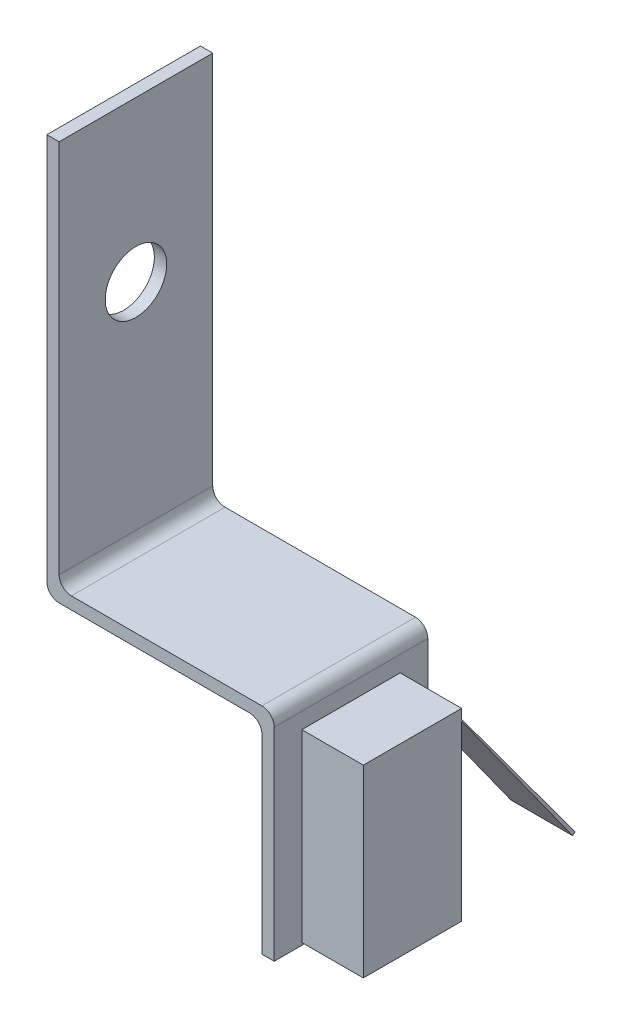
ISO-10303-21;
HEADER;
FILE_DESCRIPTION(('STEP AP214'),'2;1');
FILE_NAME('part.step','',(''),(''),'','','');
FILE_SCHEMA(('AUTOMOTIVE_DESIGN { 1 0 10303 214 1 1 1 1 }'));
ENDSEC;
DATA;
#1=APPLICATION_CONTEXT('core data for automotive mechanical design processes');
#2=APPLICATION_PROTOCOL_DEFINITION('international standard','automotive_design',2000,#1);
#3=PRODUCT_CONTEXT('',#1,'mechanical');
#4=PRODUCT('Part','Part','',(#3));
#5=PRODUCT_RELATED_PRODUCT_CATEGORY('part','',(#4));
#6=PRODUCT_DEFINITION_FORMATION('','',#4);
#7=PRODUCT_DEFINITION_CONTEXT('part definition',#1,'design');
#8=PRODUCT_DEFINITION('design','',#6,#7);
#9=PRODUCT_DEFINITION_SHAPE('','',#8);
#10=(LENGTH_UNIT() NAMED_UNIT(*) SI_UNIT(.MILLI.,.METRE.));
#11=(NAMED_UNIT(*) PLANE_ANGLE_UNIT() SI_UNIT($,.RADIAN.));
#12=(NAMED_UNIT(*) SI_UNIT($,.STERADIAN.) SOLID_ANGLE_UNIT());
#13=UNCERTAINTY_MEASURE_WITH_UNIT(LENGTH_MEASURE(1.E-05),#10,'distance_accuracy_value','');
#14=(GEOMETRIC_REPRESENTATION_CONTEXT(3) GLOBAL_UNCERTAINTY_ASSIGNED_CONTEXT((#13)) GLOBAL_UNIT_ASSIGNED_CONTEXT((#10,
#11,#12)) REPRESENTATION_CONTEXT('',''));
#15=CARTESIAN_POINT('',(0.,0.,0.));
#16=DIRECTION('',(0.,0.,1.));
#17=DIRECTION('',(1.,0.,0.));
#18=AXIS2_PLACEMENT_3D('',#15,#16,#17);
#19=CARTESIAN_POINT('',(47.,-67.6043528799355,-8.));
#20=DIRECTION('',(0.,0.,-1.));
#21=DIRECTION('',(0.,1.,0.));
#22=AXIS2_PLACEMENT_3D('',#19,#20,#21);
#23=PLANE('',#22);
#24=DIRECTION('',(1.,0.,0.));
#25=VECTOR('',#24,1.);
#26=CARTESIAN_POINT('',(37.,-69.4103994427794,-8.));
#27=LINE('',#26,#25);
#28=CARTESIAN_POINT('',(37.,-69.4103994427794,-8.));
#29=VERTEX_POINT('',#28);
#30=CARTESIAN_POINT('',(47.,-69.4103994427794,-8.));
#31=VERTEX_POINT('',#30);
#32=EDGE_CURVE('E210',#29,#31,#27,.T.);
#33=ORIENTED_EDGE('',*,*,#32,.T.);
#34=DIRECTION('',(0.,-1.,0.));
#35=VECTOR('',#34,1.);
#36=CARTESIAN_POINT('',(47.,-67.6043528799355,-8.));
#37=LINE('',#36,#35);
#38=CARTESIAN_POINT('',(47.,-97.6043528799355,-8.));
#39=VERTEX_POINT('',#38);
#40=EDGE_CURVE('E226',#31,#39,#37,.T.);
#41=ORIENTED_EDGE('',*,*,#40,.T.);
#42=DIRECTION('',(-1.,0.,0.));
#43=VECTOR('',#42,1.);
#44=CARTESIAN_POINT('',(47.,-97.6043528799355,-8.));
#45=LINE('',#44,#43);
#46=CARTESIAN_POINT('',(37.,-97.6043528799355,-8.));
#47=VERTEX_POINT('',#46);
#48=EDGE_CURVE('E247',#39,#47,#45,.T.);
#49=ORIENTED_EDGE('',*,*,#48,.T.);
#50=DIRECTION('',(0.,-1.,0.));
#51=VECTOR('',#50,1.);
#52=CARTESIAN_POINT('',(37.,-67.6043528799355,-8.));
#53=LINE('',#52,#51);
#54=EDGE_CURVE('E238',#29,#47,#53,.T.);
#55=ORIENTED_EDGE('',*,*,#54,.F.);
#56=EDGE_LOOP('',(#33,#41,#49,#55));
#57=FACE_BOUND('',#56,.T.);
#58=ADVANCED_FACE('F33',(#57),#23,.T.);
#59=CARTESIAN_POINT('',(37.,-63.,-12.5));
#60=DIRECTION('',(1.,0.,0.));
#61=DIRECTION('',(0.,0.,-1.));
#62=AXIS2_PLACEMENT_3D('',#59,#60,#61);
#63=PLANE('',#62);
#64=DIRECTION('',(0.,-0.812461065203267,-0.583015452221271));
#65=VECTOR('',#64,1.);
#66=CARTESIAN_POINT('',(37.,-94.559298490791,-26.0466454077713));
#67=LINE('',#66,#65);
#68=CARTESIAN_POINT('',(37.,-75.6813735301474,-12.5));
#69=VERTEX_POINT('',#68);
#70=EDGE_CURVE('E184',#29,#69,#67,.T.);
#71=ORIENTED_EDGE('',*,*,#70,.F.);
#72=ORIENTED_EDGE('',*,*,#54,.T.);
#73=DIRECTION('',(0.,0.,-1.));
#74=VECTOR('',#73,1.);
#75=CARTESIAN_POINT('',(37.,-97.6043528799355,8.));
#76=LINE('',#75,#74);
#77=CARTESIAN_POINT('',(37.,-97.6043528799355,8.));
#78=VERTEX_POINT('',#77);
#79=EDGE_CURVE('E235',#78,#47,#76,.T.);
#80=ORIENTED_EDGE('',*,*,#79,.F.);
#81=DIRECTION('',(0.,-1.,0.));
#82=VECTOR('',#81,1.);
#83=CARTESIAN_POINT('',(37.,-67.6043528799355,8.));
#84=LINE('',#83,#82);
#85=CARTESIAN_POINT('',(37.,-67.6043528799355,8.));
#86=VERTEX_POINT('',#85);
#87=EDGE_CURVE('E218',#86,#78,#84,.T.);
#88=ORIENTED_EDGE('',*,*,#87,.F.);
#89=DIRECTION('',(0.,0.,-1.));
#90=VECTOR('',#89,1.);
#91=CARTESIAN_POINT('',(37.,-67.6043528799355,8.));
#92=LINE('',#91,#90);
#93=CARTESIAN_POINT('',(37.,-67.6043528799355,-8.));
#94=VERTEX_POINT('',#93);
#95=EDGE_CURVE('E223',#86,#94,#92,.T.);
#96=ORIENTED_EDGE('',*,*,#95,.T.);
#97=CARTESIAN_POINT('',(37.,-69.1352525093614,-8.));
#98=VERTEX_POINT('',#97);
#99=EDGE_CURVE('E239',#94,#98,#53,.T.);
#100=ORIENTED_EDGE('',*,*,#99,.T.);
#101=DIRECTION('',(0.,0.805363368840596,0.592781447187516));
#102=VECTOR('',#101,1.);
#103=CARTESIAN_POINT('',(37.,-69.1352525093614,-8.));
#104=LINE('',#103,#102);
#105=CARTESIAN_POINT('',(37.,-75.2490321780362,-12.5));
#106=VERTEX_POINT('',#105);
#107=EDGE_CURVE('E48',#106,#98,#104,.T.);
#108=ORIENTED_EDGE('',*,*,#107,.F.);
#109=DIRECTION('',(0.,1.,0.));
#110=VECTOR('',#109,1.);
#111=CARTESIAN_POINT('',(37.,-63.,-12.5));
#112=LINE('',#111,#110);
#113=CARTESIAN_POINT('',(37.,-65.,-12.5));
#114=VERTEX_POINT('',#113);
#115=EDGE_CURVE('E292',#106,#114,#112,.T.);
#116=ORIENTED_EDGE('',*,*,#115,.T.);
#117=DIRECTION('',(0.,0.,1.));
#118=VECTOR('',#117,1.);
#119=CARTESIAN_POINT('',(37.,-65.,-12.5));
#120=LINE('',#119,#118);
#121=CARTESIAN_POINT('',(37.,-65.,12.5));
#122=VERTEX_POINT('',#121);
#123=EDGE_CURVE('E339',#114,#122,#120,.T.);
#124=ORIENTED_EDGE('',*,*,#123,.T.);
#125=DIRECTION('',(0.,1.,0.));
#126=VECTOR('',#125,1.);
#127=CARTESIAN_POINT('',(37.,-63.,12.5));
#128=LINE('',#127,#126);
#129=CARTESIAN_POINT('',(37.,-98.,12.5));
#130=VERTEX_POINT('',#129);
#131=EDGE_CURVE('E270',#130,#122,#128,.T.);
#132=ORIENTED_EDGE('',*,*,#131,.F.);
#133=DIRECTION('',(0.,0.,1.));
#134=VECTOR('',#133,1.);
#135=CARTESIAN_POINT('',(37.,-98.,-12.5));
#136=LINE('',#135,#134);
#137=CARTESIAN_POINT('',(37.,-98.,-12.5));
#138=VERTEX_POINT('',#137);
#139=EDGE_CURVE('E310',#138,#130,#136,.T.);
#140=ORIENTED_EDGE('',*,*,#139,.F.);
#141=EDGE_CURVE('E293',#138,#69,#112,.T.);
#142=ORIENTED_EDGE('',*,*,#141,.T.);
#143=EDGE_LOOP('',(#71,#72,#80,#88,#96,#100,#108,#116,#124,#132,#140,#142));
#144=FACE_BOUND('',#143,.T.);
#145=ADVANCED_FACE('F378',(#144),#63,.T.);
#146=CARTESIAN_POINT('',(0.,-65.,-12.5));
#147=DIRECTION('',(-1.,0.,0.));
#148=DIRECTION('',(0.,0.,1.));
#149=AXIS2_PLACEMENT_3D('',#146,#147,#148);
#150=PLANE('',#149);
#151=CARTESIAN_POINT('',(0.,-26.,0.));
#152=DIRECTION('',(1.,0.,0.));
#153=DIRECTION('',(0.,0.,-1.));
#154=AXIS2_PLACEMENT_3D('',#151,#152,#153);
#155=CIRCLE('',#154,5.);
#156=CARTESIAN_POINT('',(0.,-26.,-5.));
#157=VERTEX_POINT('',#156);
#158=EDGE_CURVE('E256',#157,#157,#155,.T.);
#159=ORIENTED_EDGE('',*,*,#158,.T.);
#160=EDGE_LOOP('',(#159));
#161=FACE_BOUND('',#160,.T.);
#162=DIRECTION('',(0.,-1.,0.));
#163=VECTOR('',#162,1.);
#164=CARTESIAN_POINT('',(0.,-65.,-12.5));
#165=LINE('',#164,#163);
#166=CARTESIAN_POINT('',(0.,0.,-12.5));
#167=VERTEX_POINT('',#166);
#168=CARTESIAN_POINT('',(0.,-63.,-12.5));
#169=VERTEX_POINT('',#168);
#170=EDGE_CURVE('E281',#167,#169,#165,.T.);
#171=ORIENTED_EDGE('',*,*,#170,.T.);
#172=DIRECTION('',(0.,0.,1.));
#173=VECTOR('',#172,1.);
#174=CARTESIAN_POINT('',(0.,-63.,-12.5));
#175=LINE('',#174,#173);
#176=CARTESIAN_POINT('',(0.,-63.,12.5));
#177=VERTEX_POINT('',#176);
#178=EDGE_CURVE('E320',#169,#177,#175,.T.);
#179=ORIENTED_EDGE('',*,*,#178,.T.);
#180=DIRECTION('',(0.,-1.,0.));
#181=VECTOR('',#180,1.);
#182=CARTESIAN_POINT('',(0.,-65.,12.5));
#183=LINE('',#182,#181);
#184=CARTESIAN_POINT('',(0.,0.,12.5));
#185=VERTEX_POINT('',#184);
#186=EDGE_CURVE('E259',#185,#177,#183,.T.);
#187=ORIENTED_EDGE('',*,*,#186,.F.);
#188=DIRECTION('',(0.,0.,1.));
#189=VECTOR('',#188,1.);
#190=CARTESIAN_POINT('',(0.,0.,-12.5));
#191=LINE('',#190,#189);
#192=EDGE_CURVE('E304',#167,#185,#191,.T.);
#193=ORIENTED_EDGE('',*,*,#192,.F.);
#194=EDGE_LOOP('',(#171,#179,#187,#193));
#195=FACE_BOUND('',#194,.T.);
#196=ADVANCED_FACE('F404',(#161,#195),#150,.T.);
#197=CARTESIAN_POINT('',(0.,0.,-12.5));
#198=DIRECTION('',(0.,1.,0.));
#199=DIRECTION('',(0.,0.,1.));
#200=AXIS2_PLACEMENT_3D('',#197,#198,#199);
#201=PLANE('',#200);
#202=ORIENTED_EDGE('',*,*,#192,.T.);
#203=DIRECTION('',(-1.,0.,0.));
#204=VECTOR('',#203,1.);
#205=CARTESIAN_POINT('',(0.,0.,12.5));
#206=LINE('',#205,#204);
#207=CARTESIAN_POINT('',(2.,0.,12.5));
#208=VERTEX_POINT('',#207);
#209=EDGE_CURVE('E278',#208,#185,#206,.T.);
#210=ORIENTED_EDGE('',*,*,#209,.F.);
#211=DIRECTION('',(0.,0.,1.));
#212=VECTOR('',#211,1.);
#213=CARTESIAN_POINT('',(2.,0.,-12.5));
#214=LINE('',#213,#212);
#215=CARTESIAN_POINT('',(2.,0.,-12.5));
#216=VERTEX_POINT('',#215);
#217=EDGE_CURVE('E307',#216,#208,#214,.T.);
#218=ORIENTED_EDGE('',*,*,#217,.F.);
#219=DIRECTION('',(-1.,0.,0.));
#220=VECTOR('',#219,1.);
#221=CARTESIAN_POINT('',(0.,0.,-12.5));
#222=LINE('',#221,#220);
#223=EDGE_CURVE('E300',#216,#167,#222,.T.);
#224=ORIENTED_EDGE('',*,*,#223,.T.);
#225=EDGE_LOOP('',(#202,#210,#218,#224));
#226=FACE_BOUND('',#225,.T.);
#227=ADVANCED_FACE('F407',(#226),#201,.T.);
#228=CARTESIAN_POINT('',(2.,0.,-12.5));
#229=DIRECTION('',(1.,0.,0.));
#230=DIRECTION('',(0.,1.,0.));
#231=AXIS2_PLACEMENT_3D('',#228,#229,#230);
#232=PLANE('',#231);
#233=CARTESIAN_POINT('',(2.,-26.,0.));
#234=DIRECTION('',(1.,0.,0.));
#235=DIRECTION('',(0.,0.,-1.));
#236=AXIS2_PLACEMENT_3D('',#233,#234,#235);
#237=CIRCLE('',#236,5.);
#238=CARTESIAN_POINT('',(2.,-26.,-5.));
#239=VERTEX_POINT('',#238);
#240=EDGE_CURVE('E253',#239,#239,#237,.T.);
#241=ORIENTED_EDGE('',*,*,#240,.F.);
#242=EDGE_LOOP('',(#241));
#243=FACE_BOUND('',#242,.T.);
#244=DIRECTION('',(0.,1.,0.));
#245=VECTOR('',#244,1.);
#246=CARTESIAN_POINT('',(2.,0.,12.5));
#247=LINE('',#246,#245);
#248=CARTESIAN_POINT('',(2.00000000000001,-61.,12.5));
#249=VERTEX_POINT('',#248);
#250=EDGE_CURVE('E276',#249,#208,#247,.T.);
#251=ORIENTED_EDGE('',*,*,#250,.F.);
#252=DIRECTION('',(0.,0.,1.));
#253=VECTOR('',#252,1.);
#254=CARTESIAN_POINT('',(2.00000000000001,-61.,-12.5));
#255=LINE('',#254,#253);
#256=CARTESIAN_POINT('',(2.00000000000001,-61.,-12.5));
#257=VERTEX_POINT('',#256);
#258=EDGE_CURVE('E337',#249,#257,#255,.F.);
#259=ORIENTED_EDGE('',*,*,#258,.T.);
#260=DIRECTION('',(0.,1.,0.));
#261=VECTOR('',#260,1.);
#262=CARTESIAN_POINT('',(2.,0.,-12.5));
#263=LINE('',#262,#261);
#264=EDGE_CURVE('E298',#257,#216,#263,.T.);
#265=ORIENTED_EDGE('',*,*,#264,.T.);
#266=ORIENTED_EDGE('',*,*,#217,.T.);
#267=EDGE_LOOP('',(#251,#259,#265,#266));
#268=FACE_BOUND('',#267,.T.);
#269=ADVANCED_FACE('F353',(#243,#268),#232,.T.);
#270=CARTESIAN_POINT('',(2.00000000000001,-63.,-12.5));
#271=DIRECTION('',(0.,1.,0.));
#272=DIRECTION('',(0.,0.,1.));
#273=AXIS2_PLACEMENT_3D('',#270,#271,#272);
#274=PLANE('',#273);
#275=DIRECTION('',(-1.,0.,0.));
#276=VECTOR('',#275,1.);
#277=CARTESIAN_POINT('',(2.00000000000001,-63.,-12.5));
#278=LINE('',#277,#276);
#279=CARTESIAN_POINT('',(35.,-63.,-12.5));
#280=VERTEX_POINT('',#279);
#281=CARTESIAN_POINT('',(4.00000000000001,-63.,-12.5));
#282=VERTEX_POINT('',#281);
#283=EDGE_CURVE('E295',#280,#282,#278,.T.);
#284=ORIENTED_EDGE('',*,*,#283,.T.);
#285=DIRECTION('',(0.,0.,1.));
#286=VECTOR('',#285,1.);
#287=CARTESIAN_POINT('',(4.00000000000001,-63.,12.5));
#288=LINE('',#287,#286);
#289=CARTESIAN_POINT('',(4.00000000000001,-63.,12.5));
#290=VERTEX_POINT('',#289);
#291=EDGE_CURVE('E334',#282,#290,#288,.T.);
#292=ORIENTED_EDGE('',*,*,#291,.T.);
#293=DIRECTION('',(-1.,0.,0.));
#294=VECTOR('',#293,1.);
#295=CARTESIAN_POINT('',(2.00000000000001,-63.,12.5));
#296=LINE('',#295,#294);
#297=CARTESIAN_POINT('',(35.,-63.,12.5));
#298=VERTEX_POINT('',#297);
#299=EDGE_CURVE('E273',#298,#290,#296,.T.);
#300=ORIENTED_EDGE('',*,*,#299,.F.);
#301=DIRECTION('',(0.,0.,1.));
#302=VECTOR('',#301,1.);
#303=CARTESIAN_POINT('',(35.,-63.,-12.5));
#304=LINE('',#303,#302);
#305=EDGE_CURVE('E332',#298,#280,#304,.F.);
#306=ORIENTED_EDGE('',*,*,#305,.T.);
#307=EDGE_LOOP('',(#284,#292,#300,#306));
#308=FACE_BOUND('',#307,.T.);
#309=ADVANCED_FACE('F365',(#308),#274,.T.);
#310=CARTESIAN_POINT('',(37.,-98.,-12.5));
#311=DIRECTION('',(0.,-1.,0.));
#312=DIRECTION('',(1.,0.,0.));
#313=AXIS2_PLACEMENT_3D('',#310,#311,#312);
#314=PLANE('',#313);
#315=ORIENTED_EDGE('',*,*,#139,.T.);
#316=DIRECTION('',(1.,0.,0.));
#317=VECTOR('',#316,1.);
#318=CARTESIAN_POINT('',(37.,-98.,12.5));
#319=LINE('',#318,#317);
#320=CARTESIAN_POINT('',(35.,-98.,12.5));
#321=VERTEX_POINT('',#320);
#322=EDGE_CURVE('E267',#321,#130,#319,.T.);
#323=ORIENTED_EDGE('',*,*,#322,.F.);
#324=DIRECTION('',(0.,0.,1.));
#325=VECTOR('',#324,1.);
#326=CARTESIAN_POINT('',(35.,-98.,-12.5));
#327=LINE('',#326,#325);
#328=CARTESIAN_POINT('',(35.,-98.,-12.5));
#329=VERTEX_POINT('',#328);
#330=EDGE_CURVE('E303',#329,#321,#327,.T.);
#331=ORIENTED_EDGE('',*,*,#330,.F.);
#332=DIRECTION('',(1.,0.,0.));
#333=VECTOR('',#332,1.);
#334=CARTESIAN_POINT('',(37.,-98.,-12.5));
#335=LINE('',#334,#333);
#336=EDGE_CURVE('E289',#329,#138,#335,.T.);
#337=ORIENTED_EDGE('',*,*,#336,.T.);
#338=EDGE_LOOP('',(#315,#323,#331,#337));
#339=FACE_BOUND('',#338,.T.);
#340=ADVANCED_FACE('F384',(#339),#314,.T.);
#341=CARTESIAN_POINT('',(35.,-98.,-12.5));
#342=DIRECTION('',(-1.,0.,0.));
#343=DIRECTION('',(0.,0.,1.));
#344=AXIS2_PLACEMENT_3D('',#341,#342,#343);
#345=PLANE('',#344);
#346=DIRECTION('',(0.,-1.,0.));
#347=VECTOR('',#346,1.);
#348=CARTESIAN_POINT('',(35.,-98.,12.5));
#349=LINE('',#348,#347);
#350=CARTESIAN_POINT('',(35.,-67.,12.5));
#351=VERTEX_POINT('',#350);
#352=EDGE_CURVE('E265',#351,#321,#349,.T.);
#353=ORIENTED_EDGE('',*,*,#352,.F.);
#354=DIRECTION('',(0.,0.,1.));
#355=VECTOR('',#354,1.);
#356=CARTESIAN_POINT('',(35.,-67.,-12.5));
#357=LINE('',#356,#355);
#358=CARTESIAN_POINT('',(35.,-67.,-12.5));
#359=VERTEX_POINT('',#358);
#360=EDGE_CURVE('E318',#351,#359,#357,.F.);
#361=ORIENTED_EDGE('',*,*,#360,.T.);
#362=DIRECTION('',(0.,-1.,0.));
#363=VECTOR('',#362,1.);
#364=CARTESIAN_POINT('',(35.,-98.,-12.5));
#365=LINE('',#364,#363);
#366=EDGE_CURVE('E287',#359,#329,#365,.T.);
#367=ORIENTED_EDGE('',*,*,#366,.T.);
#368=ORIENTED_EDGE('',*,*,#330,.T.);
#369=EDGE_LOOP('',(#353,#361,#367,#368));
#370=FACE_BOUND('',#369,.T.);
#371=ADVANCED_FACE('F388',(#370),#345,.T.);
#372=CARTESIAN_POINT('',(35.,-65.,-12.5));
#373=DIRECTION('',(0.,-1.,0.));
#374=DIRECTION('',(0.,0.,-1.));
#375=AXIS2_PLACEMENT_3D('',#372,#373,#374);
#376=PLANE('',#375);
#377=DIRECTION('',(1.,0.,0.));
#378=VECTOR('',#377,1.);
#379=CARTESIAN_POINT('',(35.,-65.,-12.5));
#380=LINE('',#379,#378);
#381=CARTESIAN_POINT('',(2.,-65.,-12.5));
#382=VERTEX_POINT('',#381);
#383=CARTESIAN_POINT('',(33.,-65.,-12.5));
#384=VERTEX_POINT('',#383);
#385=EDGE_CURVE('E284',#382,#384,#380,.T.);
#386=ORIENTED_EDGE('',*,*,#385,.T.);
#387=DIRECTION('',(0.,0.,1.));
#388=VECTOR('',#387,1.);
#389=CARTESIAN_POINT('',(33.,-65.,12.5));
#390=LINE('',#389,#388);
#391=CARTESIAN_POINT('',(33.,-65.,12.5));
#392=VERTEX_POINT('',#391);
#393=EDGE_CURVE('E315',#384,#392,#390,.T.);
#394=ORIENTED_EDGE('',*,*,#393,.T.);
#395=DIRECTION('',(1.,0.,0.));
#396=VECTOR('',#395,1.);
#397=CARTESIAN_POINT('',(35.,-65.,12.5));
#398=LINE('',#397,#396);
#399=CARTESIAN_POINT('',(2.,-65.,12.5));
#400=VERTEX_POINT('',#399);
#401=EDGE_CURVE('E262',#400,#392,#398,.T.);
#402=ORIENTED_EDGE('',*,*,#401,.F.);
#403=DIRECTION('',(0.,0.,1.));
#404=VECTOR('',#403,1.);
#405=CARTESIAN_POINT('',(2.,-65.,-12.5));
#406=LINE('',#405,#404);
#407=EDGE_CURVE('E306',#400,#382,#406,.F.);
#408=ORIENTED_EDGE('',*,*,#407,.T.);
#409=EDGE_LOOP('',(#386,#394,#402,#408));
#410=FACE_BOUND('',#409,.T.);
#411=ADVANCED_FACE('F396',(#410),#376,.T.);
#412=CARTESIAN_POINT('',(0.,0.,-12.5));
#413=DIRECTION('',(0.,0.,-1.));
#414=DIRECTION('',(-1.,0.,0.));
#415=AXIS2_PLACEMENT_3D('',#412,#413,#414);
#416=PLANE('',#415);
#417=ORIENTED_EDGE('',*,*,#385,.F.);
#418=CARTESIAN_POINT('',(2.,-63.,-12.5));
#419=DIRECTION('',(0.,0.,-1.));
#420=DIRECTION('',(-1.,0.,0.));
#421=AXIS2_PLACEMENT_3D('',#418,#419,#420);
#422=CIRCLE('',#421,2.);
#423=EDGE_CURVE('E330',#382,#169,#422,.T.);
#424=ORIENTED_EDGE('',*,*,#423,.T.);
#425=ORIENTED_EDGE('',*,*,#170,.F.);
#426=ORIENTED_EDGE('',*,*,#223,.F.);
#427=ORIENTED_EDGE('',*,*,#264,.F.);
#428=CARTESIAN_POINT('',(4.00000000000001,-61.,-12.5));
#429=DIRECTION('',(0.,0.,-1.));
#430=DIRECTION('',(-1.,0.,0.));
#431=AXIS2_PLACEMENT_3D('',#428,#429,#430);
#432=CIRCLE('',#431,2.);
#433=EDGE_CURVE('E11',#257,#282,#432,.F.);
#434=ORIENTED_EDGE('',*,*,#433,.T.);
#435=ORIENTED_EDGE('',*,*,#283,.F.);
#436=CARTESIAN_POINT('',(35.,-65.,-12.5));
#437=DIRECTION('',(0.,0.,-1.));
#438=DIRECTION('',(-1.,0.,0.));
#439=AXIS2_PLACEMENT_3D('',#436,#437,#438);
#440=CIRCLE('',#439,2.);
#441=EDGE_CURVE('E327',#280,#114,#440,.T.);
#442=ORIENTED_EDGE('',*,*,#441,.T.);
#443=ORIENTED_EDGE('',*,*,#115,.F.);
#444=DIRECTION('',(0.,-1.,0.));
#445=VECTOR('',#444,1.);
#446=CARTESIAN_POINT('',(37.,0.,-12.5));
#447=LINE('',#446,#445);
#448=EDGE_CURVE('E55',#106,#69,#447,.T.);
#449=ORIENTED_EDGE('',*,*,#448,.T.);
#450=ORIENTED_EDGE('',*,*,#141,.F.);
#451=ORIENTED_EDGE('',*,*,#336,.F.);
#452=ORIENTED_EDGE('',*,*,#366,.F.);
#453=CARTESIAN_POINT('',(33.,-67.,-12.5));
#454=DIRECTION('',(0.,0.,-1.));
#455=DIRECTION('',(-1.,0.,0.));
#456=AXIS2_PLACEMENT_3D('',#453,#454,#455);
#457=CIRCLE('',#456,2.);
#458=EDGE_CURVE('E344',#359,#384,#457,.F.);
#459=ORIENTED_EDGE('',*,*,#458,.T.);
#460=EDGE_LOOP('',(#417,#424,#425,#426,#427,#434,#435,#442,#443,#449,#450,#451,#452,#459));
#461=FACE_BOUND('',#460,.T.);
#462=ADVANCED_FACE('F361',(#461),#416,.T.);
#463=CARTESIAN_POINT('',(0.,0.,12.5));
#464=DIRECTION('',(0.,0.,-1.));
#465=DIRECTION('',(-1.,0.,0.));
#466=AXIS2_PLACEMENT_3D('',#463,#464,#465);
#467=PLANE('',#466);
#468=ORIENTED_EDGE('',*,*,#186,.T.);
#469=CARTESIAN_POINT('',(2.,-63.,12.5));
#470=DIRECTION('',(0.,0.,-1.));
#471=DIRECTION('',(-1.,0.,0.));
#472=AXIS2_PLACEMENT_3D('',#469,#470,#471);
#473=CIRCLE('',#472,2.);
#474=EDGE_CURVE('E325',#177,#400,#473,.F.);
#475=ORIENTED_EDGE('',*,*,#474,.T.);
#476=ORIENTED_EDGE('',*,*,#401,.T.);
#477=CARTESIAN_POINT('',(33.,-67.,12.5));
#478=DIRECTION('',(0.,0.,-1.));
#479=DIRECTION('',(-1.,0.,0.));
#480=AXIS2_PLACEMENT_3D('',#477,#478,#479);
#481=CIRCLE('',#480,2.);
#482=EDGE_CURVE('E342',#392,#351,#481,.T.);
#483=ORIENTED_EDGE('',*,*,#482,.T.);
#484=ORIENTED_EDGE('',*,*,#352,.T.);
#485=ORIENTED_EDGE('',*,*,#322,.T.);
#486=ORIENTED_EDGE('',*,*,#131,.T.);
#487=CARTESIAN_POINT('',(35.,-65.,12.5));
#488=DIRECTION('',(0.,0.,-1.));
#489=DIRECTION('',(-1.,0.,0.));
#490=AXIS2_PLACEMENT_3D('',#487,#488,#489);
#491=CIRCLE('',#490,2.);
#492=EDGE_CURVE('E323',#122,#298,#491,.F.);
#493=ORIENTED_EDGE('',*,*,#492,.T.);
#494=ORIENTED_EDGE('',*,*,#299,.T.);
#495=CARTESIAN_POINT('',(4.00000000000001,-61.,12.5));
#496=DIRECTION('',(0.,0.,-1.));
#497=DIRECTION('',(-1.,0.,0.));
#498=AXIS2_PLACEMENT_3D('',#495,#496,#497);
#499=CIRCLE('',#498,2.);
#500=EDGE_CURVE('E41',#290,#249,#499,.T.);
#501=ORIENTED_EDGE('',*,*,#500,.T.);
#502=ORIENTED_EDGE('',*,*,#250,.T.);
#503=ORIENTED_EDGE('',*,*,#209,.T.);
#504=EDGE_LOOP('',(#468,#475,#476,#483,#484,#485,#486,#493,#494,#501,#502,#503));
#505=FACE_BOUND('',#504,.T.);
#506=ADVANCED_FACE('F347',(#505),#467,.F.);
#507=CARTESIAN_POINT('',(2.,-26.,0.));
#508=DIRECTION('',(1.,0.,0.));
#509=DIRECTION('',(0.,0.,-1.));
#510=AXIS2_PLACEMENT_3D('',#507,#508,#509);
#511=CYLINDRICAL_SURFACE('',#510,5.);
#512=ORIENTED_EDGE('',*,*,#158,.F.);
#513=EDGE_LOOP('',(#512));
#514=FACE_BOUND('',#513,.T.);
#515=ORIENTED_EDGE('',*,*,#240,.T.);
#516=EDGE_LOOP('',(#515));
#517=FACE_BOUND('',#516,.T.);
#518=ADVANCED_FACE('F451',(#514,#517),#511,.F.);
#519=CARTESIAN_POINT('',(33.,-67.,-12.5));
#520=DIRECTION('',(0.,0.,-1.));
#521=DIRECTION('',(-1.,0.,0.));
#522=AXIS2_PLACEMENT_3D('',#519,#520,#521);
#523=CYLINDRICAL_SURFACE('',#522,2.);
#524=ORIENTED_EDGE('',*,*,#458,.F.);
#525=ORIENTED_EDGE('',*,*,#360,.F.);
#526=ORIENTED_EDGE('',*,*,#482,.F.);
#527=ORIENTED_EDGE('',*,*,#393,.F.);
#528=EDGE_LOOP('',(#524,#525,#526,#527));
#529=FACE_BOUND('',#528,.T.);
#530=ADVANCED_FACE('F393',(#529),#523,.F.);
#531=CARTESIAN_POINT('',(2.,-63.,-12.5));
#532=DIRECTION('',(0.,0.,1.));
#533=DIRECTION('',(1.,0.,0.));
#534=AXIS2_PLACEMENT_3D('',#531,#532,#533);
#535=CYLINDRICAL_SURFACE('',#534,2.);
#536=ORIENTED_EDGE('',*,*,#423,.F.);
#537=ORIENTED_EDGE('',*,*,#407,.F.);
#538=ORIENTED_EDGE('',*,*,#474,.F.);
#539=ORIENTED_EDGE('',*,*,#178,.F.);
#540=EDGE_LOOP('',(#536,#537,#538,#539));
#541=FACE_BOUND('',#540,.T.);
#542=ADVANCED_FACE('F402',(#541),#535,.T.);
#543=CARTESIAN_POINT('',(4.00000000000001,-61.,-12.5));
#544=DIRECTION('',(0.,0.,-1.));
#545=DIRECTION('',(-1.,0.,0.));
#546=AXIS2_PLACEMENT_3D('',#543,#544,#545);
#547=CYLINDRICAL_SURFACE('',#546,2.);
#548=ORIENTED_EDGE('',*,*,#433,.F.);
#549=ORIENTED_EDGE('',*,*,#258,.F.);
#550=ORIENTED_EDGE('',*,*,#500,.F.);
#551=ORIENTED_EDGE('',*,*,#291,.F.);
#552=EDGE_LOOP('',(#548,#549,#550,#551));
#553=FACE_BOUND('',#552,.T.);
#554=ADVANCED_FACE('F358',(#553),#547,.F.);
#555=CARTESIAN_POINT('',(35.,-65.,-12.5));
#556=DIRECTION('',(0.,0.,1.));
#557=DIRECTION('',(1.,0.,0.));
#558=AXIS2_PLACEMENT_3D('',#555,#556,#557);
#559=CYLINDRICAL_SURFACE('',#558,2.);
#560=ORIENTED_EDGE('',*,*,#441,.F.);
#561=ORIENTED_EDGE('',*,*,#305,.F.);
#562=ORIENTED_EDGE('',*,*,#492,.F.);
#563=ORIENTED_EDGE('',*,*,#123,.F.);
#564=EDGE_LOOP('',(#560,#561,#562,#563));
#565=FACE_BOUND('',#564,.T.);
#566=ADVANCED_FACE('F35',(#565),#559,.T.);
#567=CARTESIAN_POINT('',(47.,-67.6043528799355,8.));
#568=DIRECTION('',(0.,0.,-1.));
#569=DIRECTION('',(-1.,0.,0.));
#570=AXIS2_PLACEMENT_3D('',#567,#568,#569);
#571=PLANE('',#570);
#572=ORIENTED_EDGE('',*,*,#87,.T.);
#573=DIRECTION('',(-1.,0.,0.));
#574=VECTOR('',#573,1.);
#575=CARTESIAN_POINT('',(47.,-97.6043528799355,8.));
#576=LINE('',#575,#574);
#577=CARTESIAN_POINT('',(47.,-97.6043528799355,8.));
#578=VERTEX_POINT('',#577);
#579=EDGE_CURVE('E250',#578,#78,#576,.T.);
#580=ORIENTED_EDGE('',*,*,#579,.F.);
#581=DIRECTION('',(0.,-1.,0.));
#582=VECTOR('',#581,1.);
#583=CARTESIAN_POINT('',(47.,-67.6043528799355,8.));
#584=LINE('',#583,#582);
#585=CARTESIAN_POINT('',(47.,-67.6043528799355,8.));
#586=VERTEX_POINT('',#585);
#587=EDGE_CURVE('E219',#586,#578,#584,.T.);
#588=ORIENTED_EDGE('',*,*,#587,.F.);
#589=DIRECTION('',(-1.,0.,0.));
#590=VECTOR('',#589,1.);
#591=CARTESIAN_POINT('',(47.,-67.6043528799355,8.));
#592=LINE('',#591,#590);
#593=EDGE_CURVE('E232',#586,#86,#592,.T.);
#594=ORIENTED_EDGE('',*,*,#593,.T.);
#595=EDGE_LOOP('',(#572,#580,#588,#594));
#596=FACE_BOUND('',#595,.T.);
#597=ADVANCED_FACE('F437',(#596),#571,.F.);
#598=CARTESIAN_POINT('',(47.,-97.6043528799355,8.));
#599=DIRECTION('',(0.,1.,0.));
#600=DIRECTION('',(0.,0.,1.));
#601=AXIS2_PLACEMENT_3D('',#598,#599,#600);
#602=PLANE('',#601);
#603=ORIENTED_EDGE('',*,*,#79,.T.);
#604=ORIENTED_EDGE('',*,*,#48,.F.);
#605=DIRECTION('',(0.,0.,-1.));
#606=VECTOR('',#605,1.);
#607=CARTESIAN_POINT('',(47.,-97.6043528799355,8.));
#608=LINE('',#607,#606);
#609=EDGE_CURVE('E222',#578,#39,#608,.T.);
#610=ORIENTED_EDGE('',*,*,#609,.F.);
#611=ORIENTED_EDGE('',*,*,#579,.T.);
#612=EDGE_LOOP('',(#603,#604,#610,#611));
#613=FACE_BOUND('',#612,.T.);
#614=ADVANCED_FACE('F430',(#613),#602,.F.);
#615=DIRECTION('',(1.,0.,0.));
#616=VECTOR('',#615,1.);
#617=CARTESIAN_POINT('',(37.,-69.1352525093614,-8.));
#618=LINE('',#617,#616);
#619=CARTESIAN_POINT('',(47.,-69.1352525093614,-8.));
#620=VERTEX_POINT('',#619);
#621=EDGE_CURVE('E213',#98,#620,#618,.T.);
#622=ORIENTED_EDGE('',*,*,#621,.F.);
#623=ORIENTED_EDGE('',*,*,#99,.F.);
#624=DIRECTION('',(-1.,0.,0.));
#625=VECTOR('',#624,1.);
#626=CARTESIAN_POINT('',(47.,-67.6043528799355,-8.));
#627=LINE('',#626,#625);
#628=CARTESIAN_POINT('',(47.,-67.6043528799355,-8.));
#629=VERTEX_POINT('',#628);
#630=EDGE_CURVE('E244',#629,#94,#627,.T.);
#631=ORIENTED_EDGE('',*,*,#630,.F.);
#632=EDGE_CURVE('E227',#629,#620,#37,.T.);
#633=ORIENTED_EDGE('',*,*,#632,.T.);
#634=EDGE_LOOP('',(#622,#623,#631,#633));
#635=FACE_BOUND('',#634,.T.);
#636=ADVANCED_FACE('F421',(#635),#23,.T.);
#637=CARTESIAN_POINT('',(47.,-67.6043528799355,8.));
#638=DIRECTION('',(0.,1.,0.));
#639=DIRECTION('',(0.,0.,1.));
#640=AXIS2_PLACEMENT_3D('',#637,#638,#639);
#641=PLANE('',#640);
#642=ORIENTED_EDGE('',*,*,#95,.F.);
#643=ORIENTED_EDGE('',*,*,#593,.F.);
#644=DIRECTION('',(0.,0.,-1.));
#645=VECTOR('',#644,1.);
#646=CARTESIAN_POINT('',(47.,-67.6043528799355,8.));
#647=LINE('',#646,#645);
#648=EDGE_CURVE('E229',#586,#629,#647,.T.);
#649=ORIENTED_EDGE('',*,*,#648,.T.);
#650=ORIENTED_EDGE('',*,*,#630,.T.);
#651=EDGE_LOOP('',(#642,#643,#649,#650));
#652=FACE_BOUND('',#651,.T.);
#653=ADVANCED_FACE('F429',(#652),#641,.T.);
#654=CARTESIAN_POINT('',(47.,0.,0.));
#655=DIRECTION('',(1.,0.,0.));
#656=DIRECTION('',(0.,0.,-1.));
#657=AXIS2_PLACEMENT_3D('',#654,#655,#656);
#658=PLANE('',#657);
#659=ORIENTED_EDGE('',*,*,#587,.T.);
#660=ORIENTED_EDGE('',*,*,#609,.T.);
#661=ORIENTED_EDGE('',*,*,#40,.F.);
#662=DIRECTION('',(0.,-0.812461065203267,-0.583015452221271));
#663=VECTOR('',#662,1.);
#664=CARTESIAN_POINT('',(47.,-94.559298490791,-26.0466454077713));
#665=LINE('',#664,#663);
#666=CARTESIAN_POINT('',(47.,-94.559298490791,-26.0466454077713));
#667=VERTEX_POINT('',#666);
#668=EDGE_CURVE('E205',#31,#667,#665,.T.);
#669=ORIENTED_EDGE('',*,*,#668,.T.);
#670=DIRECTION('',(0.,0.590038317946311,-0.807375243214138));
#671=VECTOR('',#670,1.);
#672=CARTESIAN_POINT('',(47.,-94.2425666684797,-26.4800434165011));
#673=LINE('',#672,#671);
#674=CARTESIAN_POINT('',(47.,-94.2425666684797,-26.4800434165011));
#675=VERTEX_POINT('',#674);
#676=EDGE_CURVE('E194',#667,#675,#673,.T.);
#677=ORIENTED_EDGE('',*,*,#676,.T.);
#678=DIRECTION('',(0.,0.805363368840596,0.592781447187516));
#679=VECTOR('',#678,1.);
#680=CARTESIAN_POINT('',(47.,-69.1352525093614,-8.));
#681=LINE('',#680,#679);
#682=EDGE_CURVE('E187',#675,#620,#681,.T.);
#683=ORIENTED_EDGE('',*,*,#682,.T.);
#684=ORIENTED_EDGE('',*,*,#632,.F.);
#685=ORIENTED_EDGE('',*,*,#648,.F.);
#686=EDGE_LOOP('',(#659,#660,#661,#669,#677,#683,#684,#685));
#687=FACE_BOUND('',#686,.T.);
#688=ADVANCED_FACE('F374',(#687),#658,.T.);
#689=CARTESIAN_POINT('',(37.,-94.559298490791,-26.0466454077713));
#690=DIRECTION('',(0.,-0.583015452221271,0.812461065203267));
#691=DIRECTION('',(0.,-0.812461065203267,-0.583015452221271));
#692=AXIS2_PLACEMENT_3D('',#689,#690,#691);
#693=PLANE('',#692);
#694=ORIENTED_EDGE('',*,*,#668,.F.);
#695=ORIENTED_EDGE('',*,*,#32,.F.);
#696=ORIENTED_EDGE('',*,*,#70,.T.);
#697=CARTESIAN_POINT('',(37.,-94.559298490791,-26.0466454077713));
#698=VERTEX_POINT('',#697);
#699=EDGE_CURVE('E177',#69,#698,#67,.T.);
#700=ORIENTED_EDGE('',*,*,#699,.T.);
#701=DIRECTION('',(1.,0.,0.));
#702=VECTOR('',#701,1.);
#703=CARTESIAN_POINT('',(37.,-94.559298490791,-26.0466454077713));
#704=LINE('',#703,#702);
#705=EDGE_CURVE('E181',#698,#667,#704,.T.);
#706=ORIENTED_EDGE('',*,*,#705,.T.);
#707=EDGE_LOOP('',(#694,#695,#696,#700,#706));
#708=FACE_BOUND('',#707,.T.);
#709=ADVANCED_FACE('F180',(#708),#693,.T.);
#710=CARTESIAN_POINT('',(37.,-69.1352525093614,-8.));
#711=DIRECTION('',(0.,0.592781447187516,-0.805363368840596));
#712=DIRECTION('',(0.,0.805363368840596,0.592781447187516));
#713=AXIS2_PLACEMENT_3D('',#710,#711,#712);
#714=PLANE('',#713);
#715=ORIENTED_EDGE('',*,*,#682,.F.);
#716=DIRECTION('',(1.,0.,0.));
#717=VECTOR('',#716,1.);
#718=CARTESIAN_POINT('',(37.,-94.2425666684797,-26.4800434165011));
#719=LINE('',#718,#717);
#720=CARTESIAN_POINT('',(37.,-94.2425666684797,-26.4800434165011));
#721=VERTEX_POINT('',#720);
#722=EDGE_CURVE('E196',#721,#675,#719,.T.);
#723=ORIENTED_EDGE('',*,*,#722,.F.);
#724=EDGE_CURVE('E197',#721,#106,#104,.T.);
#725=ORIENTED_EDGE('',*,*,#724,.T.);
#726=ORIENTED_EDGE('',*,*,#107,.T.);
#727=ORIENTED_EDGE('',*,*,#621,.T.);
#728=EDGE_LOOP('',(#715,#723,#725,#726,#727));
#729=FACE_BOUND('',#728,.T.);
#730=ADVANCED_FACE('F371',(#729),#714,.T.);
#731=CARTESIAN_POINT('',(37.,-94.2425666684797,-26.4800434165011));
#732=DIRECTION('',(0.,-0.807375243214138,-0.590038317946311));
#733=DIRECTION('',(0.,0.590038317946311,-0.807375243214138));
#734=AXIS2_PLACEMENT_3D('',#731,#732,#733);
#735=PLANE('',#734);
#736=ORIENTED_EDGE('',*,*,#676,.F.);
#737=ORIENTED_EDGE('',*,*,#705,.F.);
#738=DIRECTION('',(0.,0.590038317946311,-0.807375243214138));
#739=VECTOR('',#738,1.);
#740=CARTESIAN_POINT('',(37.,-94.2425666684797,-26.4800434165011));
#741=LINE('',#740,#739);
#742=EDGE_CURVE('E192',#698,#721,#741,.T.);
#743=ORIENTED_EDGE('',*,*,#742,.T.);
#744=ORIENTED_EDGE('',*,*,#722,.T.);
#745=EDGE_LOOP('',(#736,#737,#743,#744));
#746=FACE_BOUND('',#745,.T.);
#747=ADVANCED_FACE('F191',(#746),#735,.T.);
#748=CARTESIAN_POINT('',(37.,0.,0.));
#749=DIRECTION('',(1.,0.,0.));
#750=DIRECTION('',(0.,0.,-1.));
#751=AXIS2_PLACEMENT_3D('',#748,#749,#750);
#752=PLANE('',#751);
#753=ORIENTED_EDGE('',*,*,#448,.F.);
#754=ORIENTED_EDGE('',*,*,#724,.F.);
#755=ORIENTED_EDGE('',*,*,#742,.F.);
#756=ORIENTED_EDGE('',*,*,#699,.F.);
#757=EDGE_LOOP('',(#753,#754,#755,#756));
#758=FACE_BOUND('',#757,.T.);
#759=ADVANCED_FACE('F200',(#758),#752,.F.);
#760=CLOSED_SHELL('',(#58,#145,#196,#227,#269,#309,#340,#371,#411,#462,#506,#518,#530,#542,#554,
#566,#597,#614,#636,#653,#688,#709,#730,#747,#759));
#761=MANIFOLD_SOLID_BREP('B2',#760);
#762=ADVANCED_BREP_SHAPE_REPRESENTATION('',(#18,#761),#14);
#763=SHAPE_DEFINITION_REPRESENTATION(#9,#762);
ENDSEC;
END-ISO-10303-21;
